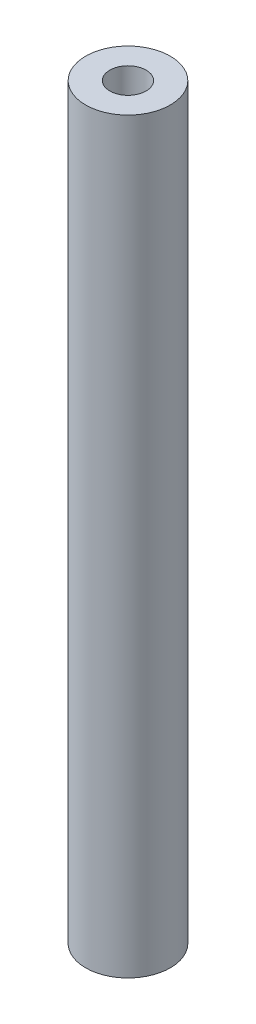
ISO-10303-21;
HEADER;
FILE_DESCRIPTION(('STEP AP214'),'2;1');
FILE_NAME('part.step','',(''),(''),'','','');
FILE_SCHEMA(('AUTOMOTIVE_DESIGN { 1 0 10303 214 1 1 1 1 }'));
ENDSEC;
DATA;
#1=APPLICATION_CONTEXT('core data for automotive mechanical design processes');
#2=APPLICATION_PROTOCOL_DEFINITION('international standard','automotive_design',2000,#1);
#3=PRODUCT_CONTEXT('',#1,'mechanical');
#4=PRODUCT('Part','Part','',(#3));
#5=PRODUCT_RELATED_PRODUCT_CATEGORY('part','',(#4));
#6=PRODUCT_DEFINITION_FORMATION('','',#4);
#7=PRODUCT_DEFINITION_CONTEXT('part definition',#1,'design');
#8=PRODUCT_DEFINITION('design','',#6,#7);
#9=PRODUCT_DEFINITION_SHAPE('','',#8);
#10=(LENGTH_UNIT() NAMED_UNIT(*) SI_UNIT(.MILLI.,.METRE.));
#11=(NAMED_UNIT(*) PLANE_ANGLE_UNIT() SI_UNIT($,.RADIAN.));
#12=(NAMED_UNIT(*) SI_UNIT($,.STERADIAN.) SOLID_ANGLE_UNIT());
#13=UNCERTAINTY_MEASURE_WITH_UNIT(LENGTH_MEASURE(1.E-05),#10,'distance_accuracy_value','');
#14=(GEOMETRIC_REPRESENTATION_CONTEXT(3) GLOBAL_UNCERTAINTY_ASSIGNED_CONTEXT((#13)) GLOBAL_UNIT_ASSIGNED_CONTEXT((#10,
#11,#12)) REPRESENTATION_CONTEXT('',''));
#15=CARTESIAN_POINT('',(0.,0.,0.));
#16=DIRECTION('',(0.,0.,1.));
#17=DIRECTION('',(1.,0.,0.));
#18=AXIS2_PLACEMENT_3D('',#15,#16,#17);
#19=CARTESIAN_POINT('',(0.,61.8,0.));
#20=DIRECTION('',(0.,1.,0.));
#21=DIRECTION('',(0.,0.,1.));
#22=AXIS2_PLACEMENT_3D('',#19,#20,#21);
#23=PLANE('',#22);
#24=CARTESIAN_POINT('',(0.,61.8,0.));
#25=DIRECTION('',(0.,1.,0.));
#26=DIRECTION('',(0.,0.,1.));
#27=AXIS2_PLACEMENT_3D('',#24,#25,#26);
#28=CIRCLE('',#27,3.5);
#29=CARTESIAN_POINT('',(0.,61.8,3.5));
#30=VERTEX_POINT('',#29);
#31=EDGE_CURVE('E10',#30,#30,#28,.T.);
#32=ORIENTED_EDGE('',*,*,#31,.T.);
#33=EDGE_LOOP('',(#32));
#34=FACE_BOUND('',#33,.T.);
#35=CARTESIAN_POINT('',(0.,61.8,0.));
#36=DIRECTION('',(0.,1.,0.));
#37=DIRECTION('',(0.,0.,1.));
#38=AXIS2_PLACEMENT_3D('',#35,#36,#37);
#39=CIRCLE('',#38,1.5);
#40=CARTESIAN_POINT('',(0.,61.8,1.5));
#41=VERTEX_POINT('',#40);
#42=EDGE_CURVE('E46',#41,#41,#39,.T.);
#43=ORIENTED_EDGE('',*,*,#42,.F.);
#44=EDGE_LOOP('',(#43));
#45=FACE_BOUND('',#44,.T.);
#46=ADVANCED_FACE('F35',(#34,#45),#23,.T.);
#47=CARTESIAN_POINT('',(0.,0.,0.));
#48=DIRECTION('',(0.,1.,0.));
#49=DIRECTION('',(0.,0.,1.));
#50=AXIS2_PLACEMENT_3D('',#47,#48,#49);
#51=PLANE('',#50);
#52=CARTESIAN_POINT('',(0.,0.,0.));
#53=DIRECTION('',(0.,1.,0.));
#54=DIRECTION('',(0.,0.,1.));
#55=AXIS2_PLACEMENT_3D('',#52,#53,#54);
#56=CIRCLE('',#55,3.5);
#57=CARTESIAN_POINT('',(0.,0.,3.5));
#58=VERTEX_POINT('',#57);
#59=EDGE_CURVE('E39',#58,#58,#56,.T.);
#60=ORIENTED_EDGE('',*,*,#59,.F.);
#61=EDGE_LOOP('',(#60));
#62=FACE_BOUND('',#61,.T.);
#63=CARTESIAN_POINT('',(0.,0.,0.));
#64=DIRECTION('',(0.,1.,0.));
#65=DIRECTION('',(0.,0.,1.));
#66=AXIS2_PLACEMENT_3D('',#63,#64,#65);
#67=CIRCLE('',#66,1.5);
#68=CARTESIAN_POINT('',(0.,0.,1.5));
#69=VERTEX_POINT('',#68);
#70=EDGE_CURVE('E48',#69,#69,#67,.T.);
#71=ORIENTED_EDGE('',*,*,#70,.T.);
#72=EDGE_LOOP('',(#71));
#73=FACE_BOUND('',#72,.T.);
#74=ADVANCED_FACE('F58',(#62,#73),#51,.F.);
#75=CARTESIAN_POINT('',(0.,61.8,0.));
#76=DIRECTION('',(0.,-1.,0.));
#77=DIRECTION('',(0.,0.,-1.));
#78=AXIS2_PLACEMENT_3D('',#75,#76,#77);
#79=CYLINDRICAL_SURFACE('',#78,3.5);
#80=ORIENTED_EDGE('',*,*,#31,.F.);
#81=EDGE_LOOP('',(#80));
#82=FACE_BOUND('',#81,.T.);
#83=ORIENTED_EDGE('',*,*,#59,.T.);
#84=EDGE_LOOP('',(#83));
#85=FACE_BOUND('',#84,.T.);
#86=ADVANCED_FACE('F37',(#82,#85),#79,.T.);
#87=CARTESIAN_POINT('',(0.,61.8,0.));
#88=DIRECTION('',(0.,-1.,0.));
#89=DIRECTION('',(0.,0.,-1.));
#90=AXIS2_PLACEMENT_3D('',#87,#88,#89);
#91=CYLINDRICAL_SURFACE('',#90,1.5);
#92=ORIENTED_EDGE('',*,*,#42,.T.);
#93=EDGE_LOOP('',(#92));
#94=FACE_BOUND('',#93,.T.);
#95=ORIENTED_EDGE('',*,*,#70,.F.);
#96=EDGE_LOOP('',(#95));
#97=FACE_BOUND('',#96,.T.);
#98=ADVANCED_FACE('F54',(#94,#97),#91,.F.);
#99=CLOSED_SHELL('',(#46,#74,#86,#98));
#100=MANIFOLD_SOLID_BREP('B2',#99);
#101=ADVANCED_BREP_SHAPE_REPRESENTATION('',(#18,#100),#14);
#102=SHAPE_DEFINITION_REPRESENTATION(#9,#101);
ENDSEC;
END-ISO-10303-21;
